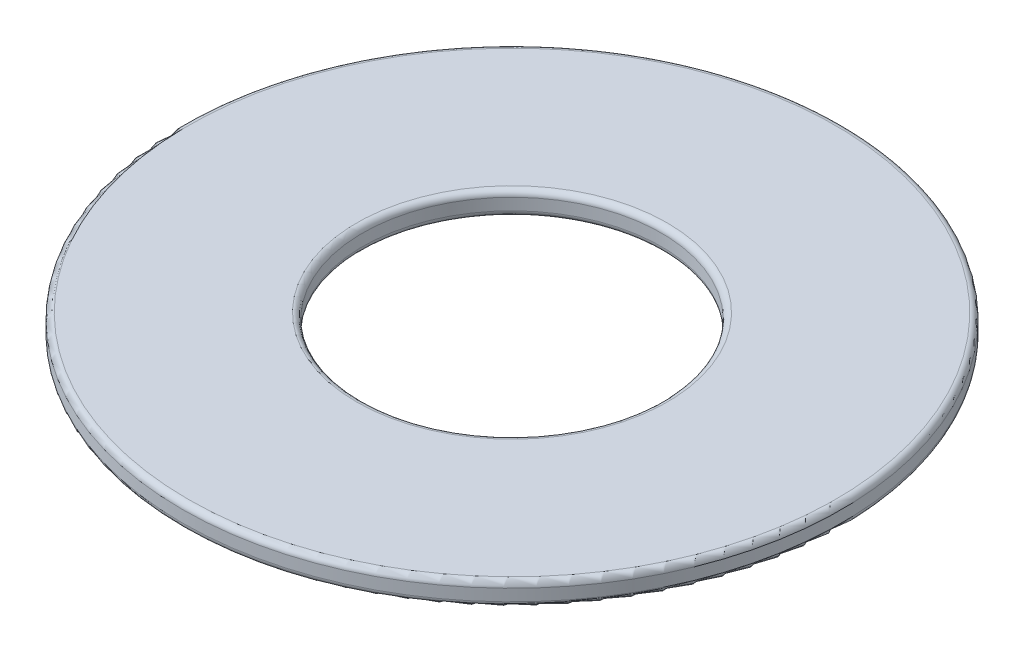
ISO-10303-21;
HEADER;
FILE_DESCRIPTION(('STEP AP214'),'2;1');
FILE_NAME('part.step','',(''),(''),'','','');
FILE_SCHEMA(('AUTOMOTIVE_DESIGN { 1 0 10303 214 1 1 1 1 }'));
ENDSEC;
DATA;
#1=APPLICATION_CONTEXT('core data for automotive mechanical design processes');
#2=APPLICATION_PROTOCOL_DEFINITION('international standard','automotive_design',2000,#1);
#3=PRODUCT_CONTEXT('',#1,'mechanical');
#4=PRODUCT('Part','Part','',(#3));
#5=PRODUCT_RELATED_PRODUCT_CATEGORY('part','',(#4));
#6=PRODUCT_DEFINITION_FORMATION('','',#4);
#7=PRODUCT_DEFINITION_CONTEXT('part definition',#1,'design');
#8=PRODUCT_DEFINITION('design','',#6,#7);
#9=PRODUCT_DEFINITION_SHAPE('','',#8);
#10=(LENGTH_UNIT() NAMED_UNIT(*) SI_UNIT(.MILLI.,.METRE.));
#11=(NAMED_UNIT(*) PLANE_ANGLE_UNIT() SI_UNIT($,.RADIAN.));
#12=(NAMED_UNIT(*) SI_UNIT($,.STERADIAN.) SOLID_ANGLE_UNIT());
#13=UNCERTAINTY_MEASURE_WITH_UNIT(LENGTH_MEASURE(1.E-05),#10,'distance_accuracy_value','');
#14=(GEOMETRIC_REPRESENTATION_CONTEXT(3) GLOBAL_UNCERTAINTY_ASSIGNED_CONTEXT((#13)) GLOBAL_UNIT_ASSIGNED_CONTEXT((#10,
#11,#12)) REPRESENTATION_CONTEXT('',''));
#15=CARTESIAN_POINT('',(0.,0.,0.));
#16=DIRECTION('',(0.,0.,1.));
#17=DIRECTION('',(1.,0.,0.));
#18=AXIS2_PLACEMENT_3D('',#15,#16,#17);
#19=CARTESIAN_POINT('',(0.,0.508,0.));
#20=DIRECTION('',(0.,1.,0.));
#21=DIRECTION('',(0.,0.,1.));
#22=AXIS2_PLACEMENT_3D('',#19,#20,#21);
#23=PLANE('',#22);
#24=CARTESIAN_POINT('',(0.,0.508,0.));
#25=DIRECTION('',(0.,1.,0.));
#26=DIRECTION('',(0.,0.,1.));
#27=AXIS2_PLACEMENT_3D('',#24,#25,#26);
#28=CIRCLE('',#27,3.3655);
#29=CARTESIAN_POINT('',(0.,0.508,3.3655));
#30=VERTEX_POINT('',#29);
#31=EDGE_CURVE('E51',#30,#30,#28,.F.);
#32=ORIENTED_EDGE('',*,*,#31,.T.);
#33=EDGE_LOOP('',(#32));
#34=FACE_BOUND('',#33,.T.);
#35=CARTESIAN_POINT('',(0.,0.508,0.));
#36=DIRECTION('',(0.,1.,0.));
#37=DIRECTION('',(0.,0.,1.));
#38=AXIS2_PLACEMENT_3D('',#35,#36,#37);
#39=CIRCLE('',#38,7.01675);
#40=CARTESIAN_POINT('',(0.,0.508,7.01675));
#41=VERTEX_POINT('',#40);
#42=EDGE_CURVE('E54',#41,#41,#39,.T.);
#43=ORIENTED_EDGE('',*,*,#42,.T.);
#44=EDGE_LOOP('',(#43));
#45=FACE_BOUND('',#44,.T.);
#46=ADVANCED_FACE('F31',(#34,#45),#23,.T.);
#47=CARTESIAN_POINT('',(0.,0.,0.));
#48=DIRECTION('',(0.,1.,0.));
#49=DIRECTION('',(0.,0.,1.));
#50=AXIS2_PLACEMENT_3D('',#47,#48,#49);
#51=PLANE('',#50);
#52=CARTESIAN_POINT('',(0.,0.,0.));
#53=DIRECTION('',(0.,1.,0.));
#54=DIRECTION('',(0.,0.,1.));
#55=AXIS2_PLACEMENT_3D('',#52,#53,#54);
#56=CIRCLE('',#55,3.3655);
#57=CARTESIAN_POINT('',(0.,0.,3.3655));
#58=VERTEX_POINT('',#57);
#59=EDGE_CURVE('E42',#58,#58,#56,.T.);
#60=ORIENTED_EDGE('',*,*,#59,.T.);
#61=EDGE_LOOP('',(#60));
#62=FACE_BOUND('',#61,.T.);
#63=CARTESIAN_POINT('',(0.,0.,0.));
#64=DIRECTION('',(0.,1.,0.));
#65=DIRECTION('',(0.,0.,1.));
#66=AXIS2_PLACEMENT_3D('',#63,#64,#65);
#67=CIRCLE('',#66,7.01675);
#68=CARTESIAN_POINT('',(0.,0.,7.01675));
#69=VERTEX_POINT('',#68);
#70=EDGE_CURVE('E46',#69,#69,#67,.F.);
#71=ORIENTED_EDGE('',*,*,#70,.T.);
#72=EDGE_LOOP('',(#71));
#73=FACE_BOUND('',#72,.T.);
#74=ADVANCED_FACE('F74',(#62,#73),#51,.F.);
#75=CARTESIAN_POINT('',(0.,0.508,0.));
#76=DIRECTION('',(0.,-1.,0.));
#77=DIRECTION('',(0.,0.,-1.));
#78=AXIS2_PLACEMENT_3D('',#75,#76,#77);
#79=CYLINDRICAL_SURFACE('',#78,7.14375);
#80=CARTESIAN_POINT('',(0.,0.127,0.));
#81=DIRECTION('',(0.,1.,0.));
#82=DIRECTION('',(0.,0.,1.));
#83=AXIS2_PLACEMENT_3D('',#80,#81,#82);
#84=CIRCLE('',#83,7.14375);
#85=CARTESIAN_POINT('',(0.,0.127,7.14375));
#86=VERTEX_POINT('',#85);
#87=EDGE_CURVE('E10',#86,#86,#84,.T.);
#88=ORIENTED_EDGE('',*,*,#87,.T.);
#89=EDGE_LOOP('',(#88));
#90=FACE_BOUND('',#89,.T.);
#91=CARTESIAN_POINT('',(0.,0.381,0.));
#92=DIRECTION('',(0.,1.,0.));
#93=DIRECTION('',(0.,0.,1.));
#94=AXIS2_PLACEMENT_3D('',#91,#92,#93);
#95=CIRCLE('',#94,7.14375);
#96=CARTESIAN_POINT('',(0.,0.381,7.14375));
#97=VERTEX_POINT('',#96);
#98=EDGE_CURVE('E38',#97,#97,#95,.F.);
#99=ORIENTED_EDGE('',*,*,#98,.T.);
#100=EDGE_LOOP('',(#99));
#101=FACE_BOUND('',#100,.T.);
#102=ADVANCED_FACE('F77',(#90,#101),#79,.T.);
#103=CARTESIAN_POINT('',(0.,0.508,0.));
#104=DIRECTION('',(0.,-1.,0.));
#105=DIRECTION('',(0.,0.,-1.));
#106=AXIS2_PLACEMENT_3D('',#103,#104,#105);
#107=CYLINDRICAL_SURFACE('',#106,3.2385);
#108=CARTESIAN_POINT('',(0.,0.381,0.));
#109=DIRECTION('',(0.,1.,0.));
#110=DIRECTION('',(0.,0.,1.));
#111=AXIS2_PLACEMENT_3D('',#108,#109,#110);
#112=CIRCLE('',#111,3.2385);
#113=CARTESIAN_POINT('',(0.,0.381,3.2385));
#114=VERTEX_POINT('',#113);
#115=EDGE_CURVE('E57',#114,#114,#112,.T.);
#116=ORIENTED_EDGE('',*,*,#115,.T.);
#117=EDGE_LOOP('',(#116));
#118=FACE_BOUND('',#117,.T.);
#119=CARTESIAN_POINT('',(0.,0.127,0.));
#120=DIRECTION('',(0.,1.,0.));
#121=DIRECTION('',(0.,0.,1.));
#122=AXIS2_PLACEMENT_3D('',#119,#120,#121);
#123=CIRCLE('',#122,3.2385);
#124=CARTESIAN_POINT('',(0.,0.127,3.2385));
#125=VERTEX_POINT('',#124);
#126=EDGE_CURVE('E60',#125,#125,#123,.F.);
#127=ORIENTED_EDGE('',*,*,#126,.T.);
#128=EDGE_LOOP('',(#127));
#129=FACE_BOUND('',#128,.T.);
#130=ADVANCED_FACE('F64',(#118,#129),#107,.F.);
#131=CARTESIAN_POINT('',(0.,0.381,0.));
#132=DIRECTION('',(0.,1.,0.));
#133=DIRECTION('',(0.,0.,1.));
#134=AXIS2_PLACEMENT_3D('',#131,#132,#133);
#135=TOROIDAL_SURFACE('',#134,3.3655,0.127);
#136=ORIENTED_EDGE('',*,*,#31,.F.);
#137=EDGE_LOOP('',(#136));
#138=FACE_BOUND('',#137,.T.);
#139=ORIENTED_EDGE('',*,*,#115,.F.);
#140=EDGE_LOOP('',(#139));
#141=FACE_BOUND('',#140,.T.);
#142=ADVANCED_FACE('F70',(#138,#141),#135,.T.);
#143=CARTESIAN_POINT('',(0.,0.127,0.));
#144=DIRECTION('',(0.,1.,0.));
#145=DIRECTION('',(0.,0.,1.));
#146=AXIS2_PLACEMENT_3D('',#143,#144,#145);
#147=TOROIDAL_SURFACE('',#146,3.3655,0.127);
#148=ORIENTED_EDGE('',*,*,#126,.F.);
#149=EDGE_LOOP('',(#148));
#150=FACE_BOUND('',#149,.T.);
#151=ORIENTED_EDGE('',*,*,#59,.F.);
#152=EDGE_LOOP('',(#151));
#153=FACE_BOUND('',#152,.T.);
#154=ADVANCED_FACE('F66',(#150,#153),#147,.T.);
#155=CARTESIAN_POINT('',(0.,0.127,0.));
#156=DIRECTION('',(0.,1.,0.));
#157=DIRECTION('',(0.,0.,1.));
#158=AXIS2_PLACEMENT_3D('',#155,#156,#157);
#159=TOROIDAL_SURFACE('',#158,7.01675,0.127);
#160=ORIENTED_EDGE('',*,*,#70,.F.);
#161=EDGE_LOOP('',(#160));
#162=FACE_BOUND('',#161,.T.);
#163=ORIENTED_EDGE('',*,*,#87,.F.);
#164=EDGE_LOOP('',(#163));
#165=FACE_BOUND('',#164,.T.);
#166=ADVANCED_FACE('F69',(#162,#165),#159,.T.);
#167=CARTESIAN_POINT('',(0.,0.381,0.));
#168=DIRECTION('',(0.,1.,0.));
#169=DIRECTION('',(0.,0.,1.));
#170=AXIS2_PLACEMENT_3D('',#167,#168,#169);
#171=TOROIDAL_SURFACE('',#170,7.01675,0.127);
#172=ORIENTED_EDGE('',*,*,#98,.F.);
#173=EDGE_LOOP('',(#172));
#174=FACE_BOUND('',#173,.T.);
#175=ORIENTED_EDGE('',*,*,#42,.F.);
#176=EDGE_LOOP('',(#175));
#177=FACE_BOUND('',#176,.T.);
#178=ADVANCED_FACE('F33',(#174,#177),#171,.T.);
#179=CLOSED_SHELL('',(#46,#74,#102,#130,#142,#154,#166,#178));
#180=MANIFOLD_SOLID_BREP('B2',#179);
#181=ADVANCED_BREP_SHAPE_REPRESENTATION('',(#18,#180),#14);
#182=SHAPE_DEFINITION_REPRESENTATION(#9,#181);
ENDSEC;
END-ISO-10303-21;
